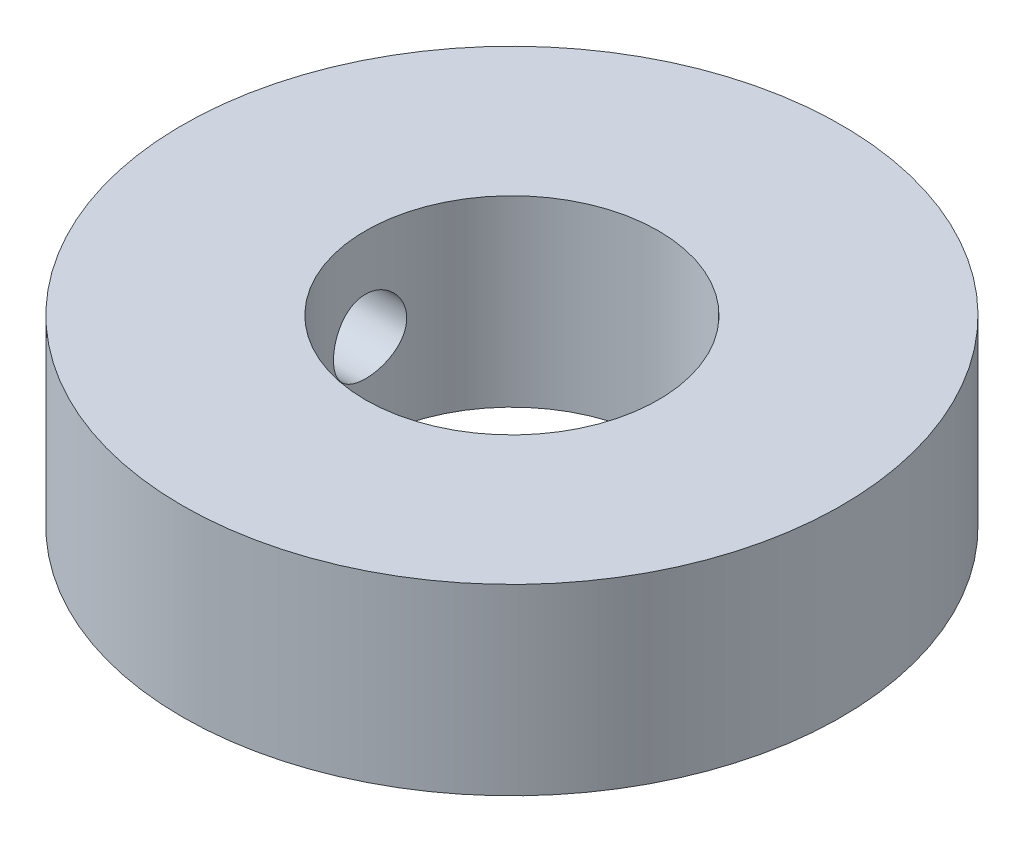
ISO-10303-21;
HEADER;
FILE_DESCRIPTION(('STEP AP214'),'2;1');
FILE_NAME('part.step','',(''),(''),'','','');
FILE_SCHEMA(('AUTOMOTIVE_DESIGN { 1 0 10303 214 1 1 1 1 }'));
ENDSEC;
DATA;
#1=APPLICATION_CONTEXT('core data for automotive mechanical design processes');
#2=APPLICATION_PROTOCOL_DEFINITION('international standard','automotive_design',2000,#1);
#3=PRODUCT_CONTEXT('',#1,'mechanical');
#4=PRODUCT('Part','Part','',(#3));
#5=PRODUCT_RELATED_PRODUCT_CATEGORY('part','',(#4));
#6=PRODUCT_DEFINITION_FORMATION('','',#4);
#7=PRODUCT_DEFINITION_CONTEXT('part definition',#1,'design');
#8=PRODUCT_DEFINITION('design','',#6,#7);
#9=PRODUCT_DEFINITION_SHAPE('','',#8);
#10=(LENGTH_UNIT() NAMED_UNIT(*) SI_UNIT(.MILLI.,.METRE.));
#11=(NAMED_UNIT(*) PLANE_ANGLE_UNIT() SI_UNIT($,.RADIAN.));
#12=(NAMED_UNIT(*) SI_UNIT($,.STERADIAN.) SOLID_ANGLE_UNIT());
#13=UNCERTAINTY_MEASURE_WITH_UNIT(LENGTH_MEASURE(1.E-05),#10,'distance_accuracy_value','');
#14=(GEOMETRIC_REPRESENTATION_CONTEXT(3) GLOBAL_UNCERTAINTY_ASSIGNED_CONTEXT((#13)) GLOBAL_UNIT_ASSIGNED_CONTEXT((#10,
#11,#12)) REPRESENTATION_CONTEXT('',''));
#15=CARTESIAN_POINT('',(0.,0.,0.));
#16=DIRECTION('',(0.,0.,1.));
#17=DIRECTION('',(1.,0.,0.));
#18=AXIS2_PLACEMENT_3D('',#15,#16,#17);
#19=CARTESIAN_POINT('',(0.,5.,0.));
#20=DIRECTION('',(0.,1.,0.));
#21=DIRECTION('',(0.,0.,1.));
#22=AXIS2_PLACEMENT_3D('',#19,#20,#21);
#23=PLANE('',#22);
#24=CARTESIAN_POINT('',(0.,5.,0.));
#25=DIRECTION('',(0.,1.,0.));
#26=DIRECTION('',(0.,0.,1.));
#27=AXIS2_PLACEMENT_3D('',#24,#25,#26);
#28=CIRCLE('',#27,9.);
#29=CARTESIAN_POINT('',(0.,5.,9.));
#30=VERTEX_POINT('',#29);
#31=EDGE_CURVE('E10',#30,#30,#28,.T.);
#32=ORIENTED_EDGE('',*,*,#31,.T.);
#33=EDGE_LOOP('',(#32));
#34=FACE_BOUND('',#33,.T.);
#35=CARTESIAN_POINT('',(0.,5.,0.));
#36=DIRECTION('',(0.,1.,0.));
#37=DIRECTION('',(0.,0.,1.));
#38=AXIS2_PLACEMENT_3D('',#35,#36,#37);
#39=CIRCLE('',#38,4.);
#40=CARTESIAN_POINT('',(0.,5.,4.));
#41=VERTEX_POINT('',#40);
#42=EDGE_CURVE('E51',#41,#41,#39,.T.);
#43=ORIENTED_EDGE('',*,*,#42,.F.);
#44=EDGE_LOOP('',(#43));
#45=FACE_BOUND('',#44,.T.);
#46=ADVANCED_FACE('F32',(#34,#45),#23,.T.);
#47=CARTESIAN_POINT('',(0.,0.,0.));
#48=DIRECTION('',(0.,1.,0.));
#49=DIRECTION('',(0.,0.,1.));
#50=AXIS2_PLACEMENT_3D('',#47,#48,#49);
#51=PLANE('',#50);
#52=CARTESIAN_POINT('',(0.,0.,0.));
#53=DIRECTION('',(0.,1.,0.));
#54=DIRECTION('',(0.,0.,1.));
#55=AXIS2_PLACEMENT_3D('',#52,#53,#54);
#56=CIRCLE('',#55,9.);
#57=CARTESIAN_POINT('',(0.,0.,9.));
#58=VERTEX_POINT('',#57);
#59=EDGE_CURVE('E46',#58,#58,#56,.T.);
#60=ORIENTED_EDGE('',*,*,#59,.F.);
#61=EDGE_LOOP('',(#60));
#62=FACE_BOUND('',#61,.T.);
#63=CARTESIAN_POINT('',(0.,0.,0.));
#64=DIRECTION('',(0.,1.,0.));
#65=DIRECTION('',(0.,0.,1.));
#66=AXIS2_PLACEMENT_3D('',#63,#64,#65);
#67=CIRCLE('',#66,4.);
#68=CARTESIAN_POINT('',(0.,0.,4.));
#69=VERTEX_POINT('',#68);
#70=EDGE_CURVE('E53',#69,#69,#67,.T.);
#71=ORIENTED_EDGE('',*,*,#70,.T.);
#72=EDGE_LOOP('',(#71));
#73=FACE_BOUND('',#72,.T.);
#74=ADVANCED_FACE('F74',(#62,#73),#51,.F.);
#75=CARTESIAN_POINT('',(0.,5.,0.));
#76=DIRECTION('',(0.,-1.,0.));
#77=DIRECTION('',(0.,0.,-1.));
#78=AXIS2_PLACEMENT_3D('',#75,#76,#77);
#79=CYLINDRICAL_SURFACE('',#78,9.);
#80=CARTESIAN_POINT('',(-8.94427190999916,2.5,-1.));
#81=CARTESIAN_POINT('',(-8.94427263367565,2.55598411347709,-0.999997592517876));
#82=CARTESIAN_POINT('',(-8.94480320415309,2.6120043997645,-0.995282822112476));
#83=CARTESIAN_POINT('',(-8.94686765346894,2.72248934405691,-0.976547278566351));
#84=CARTESIAN_POINT('',(-8.94840261407588,2.77695225862483,-0.962516471439664));
#85=CARTESIAN_POINT('',(-8.95229988148853,2.8827066190251,-0.925564609414937));
#86=CARTESIAN_POINT('',(-8.95466166163706,2.93400005929835,-0.902649212715238));
#87=CARTESIAN_POINT('',(-8.95994581317675,3.03200251564655,-0.848590069926099));
#88=CARTESIAN_POINT('',(-8.96286807969105,3.07871238692008,-0.817447862806944));
#89=CARTESIAN_POINT('',(-8.96895851522341,3.16644024909067,-0.747670331059775));
#90=CARTESIAN_POINT('',(-8.9721276141911,3.20743491317914,-0.709005756930022));
#91=CARTESIAN_POINT('',(-8.97834623227899,3.2823675269533,-0.62534378100624));
#92=CARTESIAN_POINT('',(-8.98139574572675,3.3163051422211,-0.580346079268709));
#93=CARTESIAN_POINT('',(-8.98704094371253,3.37624237130181,-0.485150487955433));
#94=CARTESIAN_POINT('',(-8.98963542778046,3.40222111861679,-0.434939383130975));
#95=CARTESIAN_POINT('',(-8.99406807097666,3.44536961809943,-0.330833735758999));
#96=CARTESIAN_POINT('',(-8.99590625254782,3.46253963166565,-0.276939302567787));
#97=CARTESIAN_POINT('',(-8.99861263899254,3.48751424661088,-0.167234004310948));
#98=CARTESIAN_POINT('',(-8.9994848352464,3.49535739589416,-0.111432014779653));
#99=CARTESIAN_POINT('',(-9.00017457787683,3.50157499865148,0.000702562392755142));
#100=CARTESIAN_POINT('',(-8.99999215751051,3.49994975070937,0.0570351332461714));
#101=CARTESIAN_POINT('',(-8.9985964714074,3.48730781760897,0.168369872939786));
#102=CARTESIAN_POINT('',(-8.99738775579826,3.47633258532411,0.223376813736901));
#103=CARTESIAN_POINT('',(-8.99408046986787,3.44536690073653,0.330763137249332));
#104=CARTESIAN_POINT('',(-8.99198188570148,3.42537630816683,0.383142479068622));
#105=CARTESIAN_POINT('',(-8.98712289889434,3.37690248439166,0.48391643975906));
#106=CARTESIAN_POINT('',(-8.98436108245632,3.34840107884412,0.532302245558591));
#107=CARTESIAN_POINT('',(-8.97848515512571,3.28372788465659,0.623619484715398));
#108=CARTESIAN_POINT('',(-8.97537103146681,3.24755581801872,0.666550720299521));
#109=CARTESIAN_POINT('',(-8.96911970576884,3.16833535845641,0.745983267326587));
#110=CARTESIAN_POINT('',(-8.96598246993296,3.125250876728,0.782448593166371));
#111=CARTESIAN_POINT('',(-8.96005521211826,3.03355323765732,0.847635154523855));
#112=CARTESIAN_POINT('',(-8.95726519085754,2.98494006888121,0.87635637402559));
#113=CARTESIAN_POINT('',(-8.95234814495897,2.88353551326512,0.925240185526869));
#114=CARTESIAN_POINT('',(-8.95022131384816,2.8307429124402,0.945400279904713));
#115=CARTESIAN_POINT('',(-8.94687537727145,2.72249299212104,0.976559666068437));
#116=CARTESIAN_POINT('',(-8.94565623749052,2.66703577344642,0.987559304165001));
#117=CARTESIAN_POINT('',(-8.94426981735941,2.55534755348248,1.00003867967784));
#118=CARTESIAN_POINT('',(-8.94409696084191,2.49912225770337,1.00156888541938));
#119=CARTESIAN_POINT('',(-8.94480795192882,2.38721608648433,0.995198759551075));
#120=CARTESIAN_POINT('',(-8.94569178183338,2.33153520194108,0.987298585903104));
#121=CARTESIAN_POINT('',(-8.94841148256716,2.22244725733016,0.962334295937792));
#122=CARTESIAN_POINT('',(-8.95024484892916,2.1690346136621,0.945294282379422));
#123=CARTESIAN_POINT('',(-8.95465502047819,2.06582531440804,0.902558706994953));
#124=CARTESIAN_POINT('',(-8.95723184653215,2.0160287603652,0.876862902220305));
#125=CARTESIAN_POINT('',(-8.96285203814234,1.9212358534032,0.817419705165276));
#126=CARTESIAN_POINT('',(-8.96589731402507,1.87626049653096,0.783639014378035));
#127=CARTESIAN_POINT('',(-8.97210513969875,1.79260013138304,0.709032406964764));
#128=CARTESIAN_POINT('',(-8.97526769307832,1.75391531578897,0.668206274613175));
#129=CARTESIAN_POINT('',(-8.98137069627024,1.68375875733989,0.580448104861647));
#130=CARTESIAN_POINT('',(-8.98431008980798,1.65232003836092,0.533489583365997));
#131=CARTESIAN_POINT('',(-8.98962004039814,1.5977758715866,0.434929579818489));
#132=CARTESIAN_POINT('',(-8.99199060680962,1.57467028668081,0.383328174176451));
#133=CARTESIAN_POINT('',(-8.99589107248185,1.53750363555143,0.277060132472967));
#134=CARTESIAN_POINT('',(-8.99742279109672,1.52342298399711,0.222400415783412));
#135=CARTESIAN_POINT('',(-8.99948048346296,1.50464205926624,0.111474600378959));
#136=CARTESIAN_POINT('',(-9.00000649258983,1.49994145614946,0.0552085582366669));
#137=CARTESIAN_POINT('',(-8.99999341978676,1.5000593318663,-0.0570091672484461));
#138=CARTESIAN_POINT('',(-8.99946005766744,1.50482669078709,-0.112960911922298));
#139=CARTESIAN_POINT('',(-8.99739948433675,1.52363751839051,-0.223263158463232));
#140=CARTESIAN_POINT('',(-8.99587227289397,1.53768098923301,-0.277613659957472));
#141=CARTESIAN_POINT('',(-8.99199497720236,1.57463042201869,-0.383167538307875));
#142=CARTESIAN_POINT('',(-8.98964506961355,1.59753448141185,-0.434371588038439));
#143=CARTESIAN_POINT('',(-8.98438359909209,1.65154959198276,-0.532216958324813));
#144=CARTESIAN_POINT('',(-8.98147203523692,1.68266065664069,-0.578858271386062));
#145=CARTESIAN_POINT('',(-8.97539414841483,1.75239744820852,-0.666515949250372));
#146=CARTESIAN_POINT('',(-8.97222658393826,1.79106126569852,-0.707501925820612));
#147=CARTESIAN_POINT('',(-8.96600400083304,1.8747286645393,-0.782425417953736));
#148=CARTESIAN_POINT('',(-8.96294900923112,1.91973375596681,-0.816361249856336));
#149=CARTESIAN_POINT('',(-8.95728742883615,2.01496158983686,-0.876307066925761));
#150=CARTESIAN_POINT('',(-8.95468224997418,2.06519997432892,-0.902292320826933));
#151=CARTESIAN_POINT('',(-8.9502319056383,2.16932571842171,-0.945422239485254));
#152=CARTESIAN_POINT('',(-8.94838589612409,2.22320894763474,-0.962576727612491));
#153=CARTESIAN_POINT('',(-8.94612126550641,2.31448893747225,-0.983351215774209));
#154=CARTESIAN_POINT('',(-8.94543110871662,2.35130518115984,-0.989585793834226));
#155=CARTESIAN_POINT('',(-8.94450619111618,2.42540893153465,-0.997910976611058));
#156=CARTESIAN_POINT('',(-8.94427142779607,2.46269643562383,-1.00000160416337));
#157=CARTESIAN_POINT('',(-8.94427190999916,2.5,-1.));
#158=B_SPLINE_CURVE_WITH_KNOTS('',3,(#80,#81,#82,#83,#84,#85,#86,#87,#88,#89,#90,#91,#92,#93,
#94,#95,#96,#97,#98,#99,#100,#101,#102,#103,#104,#105,#106,#107,#108,#109,#110,#111,#112,#113,
#114,#115,#116,#117,#118,#119,#120,#121,#122,#123,#124,#125,#126,#127,#128,#129,#130,#131,#132,
#133,#134,#135,#136,#137,#138,#139,#140,#141,#142,#143,#144,#145,#146,#147,#148,#149,#150,#151,
#152,#153,#154,#155,#156,#157),.UNSPECIFIED.,.T.,.F.,(4,2,2,2,2,2,2,2,2,2,2,2,2,2,2,2,2,2,2,2,2,
2,2,2,2,2,2,2,2,2,2,2,2,2,2,2,2,2,4),(0.,0.167816094312487,0.335813231467328,0.503703554025015,
0.671562491943663,0.840087659677713,1.00862081162626,1.17759211396053,1.34655840179297,
1.51482389806978,1.68308408815944,1.85060216087683,2.01812284004196,2.18600383962578,
2.35389092454426,2.52268489532751,2.69147921519915,2.8603227453326,3.02915989205335,
3.19709642315278,3.36503014130095,3.53252316164429,3.70002088353095,3.86822070886243,
4.03642568524668,4.20538272665268,4.37433698797282,4.54292334295312,4.71150376785724,
4.8791764590021,5.0468491891884,5.21448593656706,5.38212295929421,5.55062832814459,
5.71917389198524,5.88823852910646,6.05711468959689,6.16893521484786,6.28075512390304),.UNSPECIFIED.);
#159=CARTESIAN_POINT('',(-8.94427190999916,2.5,-1.));
#160=VERTEX_POINT('',#159);
#161=EDGE_CURVE('E56',#160,#160,#158,.T.);
#162=ORIENTED_EDGE('',*,*,#161,.T.);
#163=EDGE_LOOP('',(#162));
#164=FACE_BOUND('',#163,.T.);
#165=ORIENTED_EDGE('',*,*,#31,.F.);
#166=EDGE_LOOP('',(#165));
#167=FACE_BOUND('',#166,.T.);
#168=ORIENTED_EDGE('',*,*,#59,.T.);
#169=EDGE_LOOP('',(#168));
#170=FACE_BOUND('',#169,.T.);
#171=ADVANCED_FACE('F34',(#164,#167,#170),#79,.T.);
#172=CARTESIAN_POINT('',(0.,5.,0.));
#173=DIRECTION('',(0.,-1.,0.));
#174=DIRECTION('',(0.,0.,-1.));
#175=AXIS2_PLACEMENT_3D('',#172,#173,#174);
#176=CYLINDRICAL_SURFACE('',#175,4.);
#177=CARTESIAN_POINT('',(-3.87298334620742,2.5,-1.));
#178=CARTESIAN_POINT('',(-3.87298440057185,2.55522030035679,-0.999998431438699));
#179=CARTESIAN_POINT('',(-3.87417722499278,2.61045795943136,-0.995410498208069));
#180=CARTESIAN_POINT('',(-3.87880744892249,2.71934703123261,-0.977209250194446));
#181=CARTESIAN_POINT('',(-3.8822461547418,2.77299750177996,-0.963590682698077));
#182=CARTESIAN_POINT('',(-3.89095489813012,2.87712141528784,-0.927796479849635));
#183=CARTESIAN_POINT('',(-3.8962225706936,2.92759886215776,-0.905631891140943));
#184=CARTESIAN_POINT('',(-3.90799276818327,3.02412434101248,-0.853408456505407));
#185=CARTESIAN_POINT('',(-3.91449534553241,3.07017218483115,-0.823349275424505));
#186=CARTESIAN_POINT('',(-3.92816286540368,3.15754465810584,-0.755483370924517));
#187=CARTESIAN_POINT('',(-3.93533839048709,3.19875744014028,-0.717534755081557));
#188=CARTESIAN_POINT('',(-3.94945150206622,3.27430455774388,-0.635272825640328));
#189=CARTESIAN_POINT('',(-3.95638906626691,3.30863825024863,-0.590958917672139));
#190=CARTESIAN_POINT('',(-3.96936166208095,3.36991018705258,-0.496458080431564));
#191=CARTESIAN_POINT('',(-3.975382749602,3.3967385552646,-0.446197830478043));
#192=CARTESIAN_POINT('',(-3.9857232477043,3.44152385766121,-0.341705273717109));
#193=CARTESIAN_POINT('',(-3.99004290933747,3.4594821007662,-0.287473554316777));
#194=CARTESIAN_POINT('',(-3.99641903539262,3.48565913383144,-0.177743503501663));
#195=CARTESIAN_POINT('',(-3.99851957537723,3.49406785773063,-0.12229308781959));
#196=CARTESIAN_POINT('',(-4.00037437642922,3.50150335171022,-0.010731527705108));
#197=CARTESIAN_POINT('',(-4.00012898438682,3.50053150888384,0.0453795178152273));
#198=CARTESIAN_POINT('',(-3.99735237981413,3.48937005989994,0.155352247172387));
#199=CARTESIAN_POINT('',(-3.99487200936349,3.47938546997846,0.209236215601067));
#200=CARTESIAN_POINT('',(-3.98796334609942,3.4508114919806,0.314538247413686));
#201=CARTESIAN_POINT('',(-3.98353494959376,3.43222164584904,0.365956179370438));
#202=CARTESIAN_POINT('',(-3.97315003880358,3.38679897172517,0.465406703501807));
#203=CARTESIAN_POINT('',(-3.96718007878021,3.3598931821353,0.513404509766504));
#204=CARTESIAN_POINT('',(-3.9543596152386,3.2986577283535,0.604275622340489));
#205=CARTESIAN_POINT('',(-3.94750895860996,3.26432677257575,0.647148035085505));
#206=CARTESIAN_POINT('',(-3.93345485507808,3.18811650320705,0.727774035084956));
#207=CARTESIAN_POINT('',(-3.92624687810367,3.14605804306089,0.765357679075199));
#208=CARTESIAN_POINT('',(-3.91246017406683,3.0561600105839,0.832976375963019));
#209=CARTESIAN_POINT('',(-3.90588147642388,3.0083201682036,0.863011076046016));
#210=CARTESIAN_POINT('',(-3.89408198732659,2.90788398634041,0.914788129022598));
#211=CARTESIAN_POINT('',(-3.88886793490288,2.85526570787472,0.936489566970491));
#212=CARTESIAN_POINT('',(-3.88047456055983,2.74696581276942,0.970685620636341));
#213=CARTESIAN_POINT('',(-3.87729480324087,2.69128485440675,0.98318220655291));
#214=CARTESIAN_POINT('',(-3.87342142415656,2.58001619939075,0.998331855466071));
#215=CARTESIAN_POINT('',(-3.87266435637459,2.52446488266815,1.00123618956785));
#216=CARTESIAN_POINT('',(-3.87354937392416,2.41367122536874,0.997806796206219));
#217=CARTESIAN_POINT('',(-3.87519123840506,2.3584288568195,0.99147391913952));
#218=CARTESIAN_POINT('',(-3.88062832781824,2.25075429401812,0.969970185575065));
#219=CARTESIAN_POINT('',(-3.8843878809375,2.19829090937166,0.954945627312698));
#220=CARTESIAN_POINT('',(-3.89360287308385,2.09662741685933,0.916647232668248));
#221=CARTESIAN_POINT('',(-3.89905851299445,2.04742769637786,0.893372419085018));
#222=CARTESIAN_POINT('',(-3.91118454837305,1.95262348885306,0.838708267174623));
#223=CARTESIAN_POINT('',(-3.91787667442657,1.90710846398276,0.807168701534251));
#224=CARTESIAN_POINT('',(-3.93166833228686,1.82192465487946,0.737060292934456));
#225=CARTESIAN_POINT('',(-3.93876793091388,1.78225683333997,0.698490294805439));
#226=CARTESIAN_POINT('',(-3.95278961212643,1.70887558297162,0.614262720984726));
#227=CARTESIAN_POINT('',(-3.95970280824734,1.67533597498047,0.568451952531592));
#228=CARTESIAN_POINT('',(-3.97238886645494,1.6164256532195,0.471702682694675));
#229=CARTESIAN_POINT('',(-3.97816178801584,1.59105451335672,0.420764448957591));
#230=CARTESIAN_POINT('',(-3.98788046295326,1.54942158618883,0.31555820173109));
#231=CARTESIAN_POINT('',(-3.99183932008964,1.53309428624838,0.261317381027881));
#232=CARTESIAN_POINT('',(-3.99754117358315,1.50981586615663,0.150749760318808));
#233=CARTESIAN_POINT('',(-3.99928459757363,1.50286293650438,0.0944233650412436));
#234=CARTESIAN_POINT('',(-4.00034169408811,1.49863241042447,-0.0170835264433261));
#235=CARTESIAN_POINT('',(-3.99971978880008,1.50109829090461,-0.0722538269660327));
#236=CARTESIAN_POINT('',(-3.99625896457423,1.51504782729433,-0.181367496414739));
#237=CARTESIAN_POINT('',(-3.99342011157094,1.5265312150131,-0.235310901780886));
#238=CARTESIAN_POINT('',(-3.98585432853963,1.55805221977093,-0.340171035644816));
#239=CARTESIAN_POINT('',(-3.98113764502668,1.57804345331462,-0.391102494581019));
#240=CARTESIAN_POINT('',(-3.97031288913382,1.62597057901933,-0.488917053041468));
#241=CARTESIAN_POINT('',(-3.96420464137727,1.65390747266957,-0.535799641265051));
#242=CARTESIAN_POINT('',(-3.95107249681342,1.71771523399707,-0.6254019284239));
#243=CARTESIAN_POINT('',(-3.94403016945647,1.75376014290737,-0.667994988300587));
#244=CARTESIAN_POINT('',(-3.92990649053207,1.83242285197381,-0.746615020271252));
#245=CARTESIAN_POINT('',(-3.92282512952424,1.87504231609794,-0.782640325068178));
#246=CARTESIAN_POINT('',(-3.90927475860683,1.96660141420129,-0.84776202647924));
#247=CARTESIAN_POINT('',(-3.90281963730391,2.01564412341248,-0.876716619446593));
#248=CARTESIAN_POINT('',(-3.8914395555011,2.11805548992285,-0.925926896615622));
#249=CARTESIAN_POINT('',(-3.88651348244814,2.17142096610729,-0.946188909759556));
#250=CARTESIAN_POINT('',(-3.87951908741315,2.27057701182628,-0.974422528565571));
#251=CARTESIAN_POINT('',(-3.87708663005761,2.31589316438236,-0.983993170595829));
#252=CARTESIAN_POINT('',(-3.87381838580358,2.40746886900147,-0.996782292572819));
#253=CARTESIAN_POINT('',(-3.87298246270639,2.45372834025063,-1.00000131437052));
#254=CARTESIAN_POINT('',(-3.87298334620742,2.5,-1.));
#255=B_SPLINE_CURVE_WITH_KNOTS('',3,(#177,#178,#179,#180,#181,#182,#183,#184,#185,#186,#187,
#188,#189,#190,#191,#192,#193,#194,#195,#196,#197,#198,#199,#200,#201,#202,#203,#204,#205,#206,
#207,#208,#209,#210,#211,#212,#213,#214,#215,#216,#217,#218,#219,#220,#221,#222,#223,#224,#225,
#226,#227,#228,#229,#230,#231,#232,#233,#234,#235,#236,#237,#238,#239,#240,#241,#242,#243,#244,
#245,#246,#247,#248,#249,#250,#251,#252,#253,#254),.UNSPECIFIED.,.T.,.F.,(4,2,2,2,2,2,2,2,2,2,2,
2,2,2,2,2,2,2,2,2,2,2,2,2,2,2,2,2,2,2,2,2,2,2,2,2,2,2,4),(0.,0.16549097667523,0.331078296534211,
0.496452290829152,0.661833306984658,0.830495816734649,0.999174085882211,1.17020598555442,
1.34121263935111,1.50875500394413,1.67627259462683,1.84007305071853,2.00388222686189,
2.16917149698052,2.3344895418384,2.50428186625039,2.67408212476195,2.84470572799635,
3.01529280048093,3.18137429900961,3.34744050869795,3.51078961999957,3.67415808564842,
3.84073138339937,4.00733207550292,4.17810132382402,4.34886166284096,4.51836829119046,
4.6878421955989,4.85273378447257,5.01762046947067,5.18161950620159,5.34563922291503,
5.51358838629103,5.68158012622478,5.85270590910145,6.02370688542922,6.16239130867206,
6.30106390036083),.UNSPECIFIED.);
#256=CARTESIAN_POINT('',(-3.87298334620742,2.5,-1.));
#257=VERTEX_POINT('',#256);
#258=EDGE_CURVE('E37',#257,#257,#255,.T.);
#259=ORIENTED_EDGE('',*,*,#258,.F.);
#260=EDGE_LOOP('',(#259));
#261=FACE_BOUND('',#260,.T.);
#262=ORIENTED_EDGE('',*,*,#42,.T.);
#263=EDGE_LOOP('',(#262));
#264=FACE_BOUND('',#263,.T.);
#265=ORIENTED_EDGE('',*,*,#70,.F.);
#266=EDGE_LOOP('',(#265));
#267=FACE_BOUND('',#266,.T.);
#268=ADVANCED_FACE('F66',(#261,#264,#267),#176,.F.);
#269=CARTESIAN_POINT('',(-15.,2.5,0.));
#270=DIRECTION('',(1.,0.,0.));
#271=DIRECTION('',(0.,0.,-1.));
#272=AXIS2_PLACEMENT_3D('',#269,#270,#271);
#273=CYLINDRICAL_SURFACE('',#272,1.);
#274=ORIENTED_EDGE('',*,*,#258,.T.);
#275=EDGE_LOOP('',(#274));
#276=FACE_BOUND('',#275,.T.);
#277=ORIENTED_EDGE('',*,*,#161,.F.);
#278=EDGE_LOOP('',(#277));
#279=FACE_BOUND('',#278,.T.);
#280=ADVANCED_FACE('F63',(#276,#279),#273,.F.);
#281=CLOSED_SHELL('',(#46,#74,#171,#268,#280));
#282=MANIFOLD_SOLID_BREP('B2',#281);
#283=ADVANCED_BREP_SHAPE_REPRESENTATION('',(#18,#282),#14);
#284=SHAPE_DEFINITION_REPRESENTATION(#9,#283);
ENDSEC;
END-ISO-10303-21;
